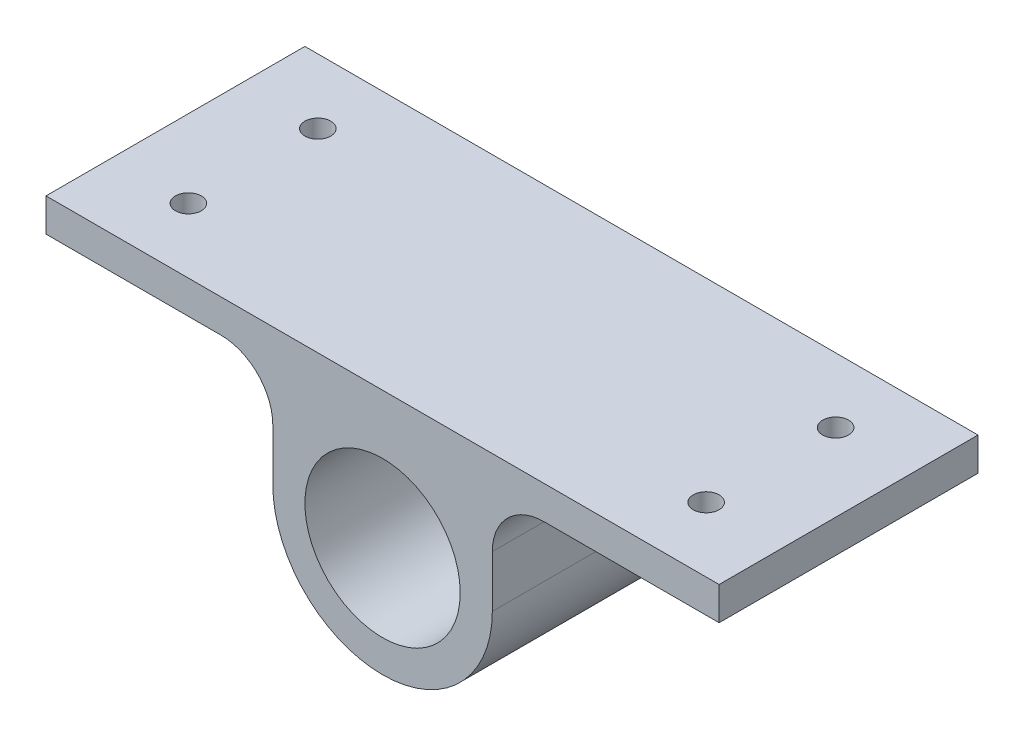
ISO-10303-21;
HEADER;
FILE_DESCRIPTION(('STEP AP214'),'2;1');
FILE_NAME('part.step','',(''),(''),'','','');
FILE_SCHEMA(('AUTOMOTIVE_DESIGN { 1 0 10303 214 1 1 1 1 }'));
ENDSEC;
DATA;
#1=APPLICATION_CONTEXT('core data for automotive mechanical design processes');
#2=APPLICATION_PROTOCOL_DEFINITION('international standard','automotive_design',2000,#1);
#3=PRODUCT_CONTEXT('',#1,'mechanical');
#4=PRODUCT('Part','Part','',(#3));
#5=PRODUCT_RELATED_PRODUCT_CATEGORY('part','',(#4));
#6=PRODUCT_DEFINITION_FORMATION('','',#4);
#7=PRODUCT_DEFINITION_CONTEXT('part definition',#1,'design');
#8=PRODUCT_DEFINITION('design','',#6,#7);
#9=PRODUCT_DEFINITION_SHAPE('','',#8);
#10=(LENGTH_UNIT() NAMED_UNIT(*) SI_UNIT(.MILLI.,.METRE.));
#11=(NAMED_UNIT(*) PLANE_ANGLE_UNIT() SI_UNIT($,.RADIAN.));
#12=(NAMED_UNIT(*) SI_UNIT($,.STERADIAN.) SOLID_ANGLE_UNIT());
#13=UNCERTAINTY_MEASURE_WITH_UNIT(LENGTH_MEASURE(1.E-05),#10,'distance_accuracy_value','');
#14=(GEOMETRIC_REPRESENTATION_CONTEXT(3) GLOBAL_UNCERTAINTY_ASSIGNED_CONTEXT((#13)) GLOBAL_UNIT_ASSIGNED_CONTEXT((#10,
#11,#12)) REPRESENTATION_CONTEXT('',''));
#15=CARTESIAN_POINT('',(0.,0.,0.));
#16=DIRECTION('',(0.,0.,1.));
#17=DIRECTION('',(1.,0.,0.));
#18=AXIS2_PLACEMENT_3D('',#15,#16,#17);
#19=CARTESIAN_POINT('',(0.,0.,250.));
#20=DIRECTION('',(0.,0.,1.));
#21=DIRECTION('',(1.,0.,0.));
#22=AXIS2_PLACEMENT_3D('',#19,#20,#21);
#23=PLANE('',#22);
#24=CARTESIAN_POINT('',(0.,0.,250.));
#25=DIRECTION('',(0.,0.,1.));
#26=DIRECTION('',(1.,0.,0.));
#27=AXIS2_PLACEMENT_3D('',#24,#25,#26);
#28=CIRCLE('',#27,106.);
#29=CARTESIAN_POINT('',(-106.,0.,250.));
#30=VERTEX_POINT('',#29);
#31=CARTESIAN_POINT('',(106.,0.,250.));
#32=VERTEX_POINT('',#31);
#33=EDGE_CURVE('E167',#30,#32,#28,.T.);
#34=ORIENTED_EDGE('',*,*,#33,.T.);
#35=DIRECTION('',(0.,1.,0.));
#36=VECTOR('',#35,1.);
#37=CARTESIAN_POINT('',(106.,50.,250.));
#38=LINE('',#37,#36);
#39=CARTESIAN_POINT('',(106.,50.,250.));
#40=VERTEX_POINT('',#39);
#41=EDGE_CURVE('E105',#32,#40,#38,.T.);
#42=ORIENTED_EDGE('',*,*,#41,.T.);
#43=CARTESIAN_POINT('',(156.,50.,250.));
#44=DIRECTION('',(0.,0.,-1.));
#45=DIRECTION('',(1.,0.,0.));
#46=AXIS2_PLACEMENT_3D('',#43,#44,#45);
#47=CIRCLE('',#46,50.);
#48=CARTESIAN_POINT('',(156.,100.,250.));
#49=VERTEX_POINT('',#48);
#50=EDGE_CURVE('E215',#40,#49,#47,.T.);
#51=ORIENTED_EDGE('',*,*,#50,.T.);
#52=DIRECTION('',(1.,0.,0.));
#53=VECTOR('',#52,1.);
#54=CARTESIAN_POINT('',(325.,100.,250.));
#55=LINE('',#54,#53);
#56=CARTESIAN_POINT('',(325.,100.,250.));
#57=VERTEX_POINT('',#56);
#58=EDGE_CURVE('E217',#49,#57,#55,.T.);
#59=ORIENTED_EDGE('',*,*,#58,.T.);
#60=DIRECTION('',(0.,1.,0.));
#61=VECTOR('',#60,1.);
#62=CARTESIAN_POINT('',(325.,132.,250.));
#63=LINE('',#62,#61);
#64=CARTESIAN_POINT('',(325.,132.,250.));
#65=VERTEX_POINT('',#64);
#66=EDGE_CURVE('E219',#57,#65,#63,.T.);
#67=ORIENTED_EDGE('',*,*,#66,.T.);
#68=DIRECTION('',(-1.,0.,0.));
#69=VECTOR('',#68,1.);
#70=CARTESIAN_POINT('',(-325.,132.,250.));
#71=LINE('',#70,#69);
#72=CARTESIAN_POINT('',(-325.,132.,250.));
#73=VERTEX_POINT('',#72);
#74=EDGE_CURVE('E221',#65,#73,#71,.T.);
#75=ORIENTED_EDGE('',*,*,#74,.T.);
#76=DIRECTION('',(0.,-1.,0.));
#77=VECTOR('',#76,1.);
#78=CARTESIAN_POINT('',(-325.,100.,250.));
#79=LINE('',#78,#77);
#80=CARTESIAN_POINT('',(-325.,100.,250.));
#81=VERTEX_POINT('',#80);
#82=EDGE_CURVE('E130',#73,#81,#79,.T.);
#83=ORIENTED_EDGE('',*,*,#82,.T.);
#84=DIRECTION('',(1.,0.,0.));
#85=VECTOR('',#84,1.);
#86=CARTESIAN_POINT('',(-156.,100.,250.));
#87=LINE('',#86,#85);
#88=CARTESIAN_POINT('',(-156.,100.,250.));
#89=VERTEX_POINT('',#88);
#90=EDGE_CURVE('E124',#81,#89,#87,.T.);
#91=ORIENTED_EDGE('',*,*,#90,.T.);
#92=CARTESIAN_POINT('',(-156.,50.,250.));
#93=DIRECTION('',(0.,0.,-1.));
#94=DIRECTION('',(1.,0.,0.));
#95=AXIS2_PLACEMENT_3D('',#92,#93,#94);
#96=CIRCLE('',#95,50.);
#97=CARTESIAN_POINT('',(-106.,49.9999999999997,250.));
#98=VERTEX_POINT('',#97);
#99=EDGE_CURVE('E128',#89,#98,#96,.T.);
#100=ORIENTED_EDGE('',*,*,#99,.T.);
#101=DIRECTION('',(0.,-1.,0.));
#102=VECTOR('',#101,1.);
#103=CARTESIAN_POINT('',(-106.,0.,250.));
#104=LINE('',#103,#102);
#105=EDGE_CURVE('E56',#98,#30,#104,.T.);
#106=ORIENTED_EDGE('',*,*,#105,.T.);
#107=EDGE_LOOP('',(#34,#42,#51,#59,#67,#75,#83,#91,#100,#106));
#108=FACE_BOUND('',#107,.T.);
#109=CARTESIAN_POINT('',(0.,0.,250.));
#110=DIRECTION('',(0.,0.,1.));
#111=DIRECTION('',(1.,0.,0.));
#112=AXIS2_PLACEMENT_3D('',#109,#110,#111);
#113=CIRCLE('',#112,75.);
#114=CARTESIAN_POINT('',(75.,0.,250.));
#115=VERTEX_POINT('',#114);
#116=EDGE_CURVE('E152',#115,#115,#113,.T.);
#117=ORIENTED_EDGE('',*,*,#116,.F.);
#118=EDGE_LOOP('',(#117));
#119=FACE_BOUND('',#118,.T.);
#120=ADVANCED_FACE('F37',(#108,#119),#23,.T.);
#121=CARTESIAN_POINT('',(0.,0.,0.));
#122=DIRECTION('',(0.,0.,1.));
#123=DIRECTION('',(1.,0.,0.));
#124=AXIS2_PLACEMENT_3D('',#121,#122,#123);
#125=PLANE('',#124);
#126=CARTESIAN_POINT('',(0.,0.,0.));
#127=DIRECTION('',(0.,0.,1.));
#128=DIRECTION('',(1.,0.,0.));
#129=AXIS2_PLACEMENT_3D('',#126,#127,#128);
#130=CIRCLE('',#129,106.);
#131=CARTESIAN_POINT('',(-106.,0.,0.));
#132=VERTEX_POINT('',#131);
#133=CARTESIAN_POINT('',(106.,0.,0.));
#134=VERTEX_POINT('',#133);
#135=EDGE_CURVE('E148',#132,#134,#130,.T.);
#136=ORIENTED_EDGE('',*,*,#135,.F.);
#137=DIRECTION('',(0.,-1.,0.));
#138=VECTOR('',#137,1.);
#139=CARTESIAN_POINT('',(-106.,0.,0.));
#140=LINE('',#139,#138);
#141=CARTESIAN_POINT('',(-106.,49.9999999999997,0.));
#142=VERTEX_POINT('',#141);
#143=EDGE_CURVE('E97',#142,#132,#140,.T.);
#144=ORIENTED_EDGE('',*,*,#143,.F.);
#145=CARTESIAN_POINT('',(-156.,50.,0.));
#146=DIRECTION('',(0.,0.,-1.));
#147=DIRECTION('',(1.,0.,0.));
#148=AXIS2_PLACEMENT_3D('',#145,#146,#147);
#149=CIRCLE('',#148,50.);
#150=CARTESIAN_POINT('',(-156.,100.,0.));
#151=VERTEX_POINT('',#150);
#152=EDGE_CURVE('E91',#151,#142,#149,.T.);
#153=ORIENTED_EDGE('',*,*,#152,.F.);
#154=DIRECTION('',(1.,0.,0.));
#155=VECTOR('',#154,1.);
#156=CARTESIAN_POINT('',(-156.,100.,0.));
#157=LINE('',#156,#155);
#158=CARTESIAN_POINT('',(-325.,100.,0.));
#159=VERTEX_POINT('',#158);
#160=EDGE_CURVE('E138',#159,#151,#157,.T.);
#161=ORIENTED_EDGE('',*,*,#160,.F.);
#162=DIRECTION('',(0.,-1.,0.));
#163=VECTOR('',#162,1.);
#164=CARTESIAN_POINT('',(-325.,100.,0.));
#165=LINE('',#164,#163);
#166=CARTESIAN_POINT('',(-325.,132.,0.));
#167=VERTEX_POINT('',#166);
#168=EDGE_CURVE('E162',#167,#159,#165,.T.);
#169=ORIENTED_EDGE('',*,*,#168,.F.);
#170=DIRECTION('',(-1.,0.,0.));
#171=VECTOR('',#170,1.);
#172=CARTESIAN_POINT('',(-325.,132.,0.));
#173=LINE('',#172,#171);
#174=CARTESIAN_POINT('',(325.,132.,0.));
#175=VERTEX_POINT('',#174);
#176=EDGE_CURVE('E160',#175,#167,#173,.T.);
#177=ORIENTED_EDGE('',*,*,#176,.F.);
#178=DIRECTION('',(0.,1.,0.));
#179=VECTOR('',#178,1.);
#180=CARTESIAN_POINT('',(325.,132.,0.));
#181=LINE('',#180,#179);
#182=CARTESIAN_POINT('',(325.,100.,0.));
#183=VERTEX_POINT('',#182);
#184=EDGE_CURVE('E158',#183,#175,#181,.T.);
#185=ORIENTED_EDGE('',*,*,#184,.F.);
#186=DIRECTION('',(1.,0.,0.));
#187=VECTOR('',#186,1.);
#188=CARTESIAN_POINT('',(325.,100.,0.));
#189=LINE('',#188,#187);
#190=CARTESIAN_POINT('',(156.,100.,0.));
#191=VERTEX_POINT('',#190);
#192=EDGE_CURVE('E156',#191,#183,#189,.T.);
#193=ORIENTED_EDGE('',*,*,#192,.F.);
#194=CARTESIAN_POINT('',(156.,50.,0.));
#195=DIRECTION('',(0.,0.,-1.));
#196=DIRECTION('',(1.,0.,0.));
#197=AXIS2_PLACEMENT_3D('',#194,#195,#196);
#198=CIRCLE('',#197,50.);
#199=CARTESIAN_POINT('',(106.,50.,0.));
#200=VERTEX_POINT('',#199);
#201=EDGE_CURVE('E154',#200,#191,#198,.T.);
#202=ORIENTED_EDGE('',*,*,#201,.F.);
#203=DIRECTION('',(0.,1.,0.));
#204=VECTOR('',#203,1.);
#205=CARTESIAN_POINT('',(106.,50.,0.));
#206=LINE('',#205,#204);
#207=EDGE_CURVE('E151',#134,#200,#206,.T.);
#208=ORIENTED_EDGE('',*,*,#207,.F.);
#209=EDGE_LOOP('',(#136,#144,#153,#161,#169,#177,#185,#193,#202,#208));
#210=FACE_BOUND('',#209,.T.);
#211=CARTESIAN_POINT('',(0.,0.,0.));
#212=DIRECTION('',(0.,0.,1.));
#213=DIRECTION('',(1.,0.,0.));
#214=AXIS2_PLACEMENT_3D('',#211,#212,#213);
#215=CIRCLE('',#214,75.);
#216=CARTESIAN_POINT('',(75.,0.,0.));
#217=VERTEX_POINT('',#216);
#218=EDGE_CURVE('E208',#217,#217,#215,.T.);
#219=ORIENTED_EDGE('',*,*,#218,.T.);
#220=EDGE_LOOP('',(#219));
#221=FACE_BOUND('',#220,.T.);
#222=ADVANCED_FACE('F234',(#210,#221),#125,.F.);
#223=CARTESIAN_POINT('',(0.,0.,250.));
#224=DIRECTION('',(0.,0.,-1.));
#225=DIRECTION('',(-1.,0.,0.));
#226=AXIS2_PLACEMENT_3D('',#223,#224,#225);
#227=CYLINDRICAL_SURFACE('',#226,106.);
#228=ORIENTED_EDGE('',*,*,#135,.T.);
#229=DIRECTION('',(0.,0.,-1.));
#230=VECTOR('',#229,1.);
#231=CARTESIAN_POINT('',(106.,0.,250.));
#232=LINE('',#231,#230);
#233=EDGE_CURVE('E11',#32,#134,#232,.T.);
#234=ORIENTED_EDGE('',*,*,#233,.F.);
#235=ORIENTED_EDGE('',*,*,#33,.F.);
#236=DIRECTION('',(0.,0.,-1.));
#237=VECTOR('',#236,1.);
#238=CARTESIAN_POINT('',(-106.,0.,250.));
#239=LINE('',#238,#237);
#240=EDGE_CURVE('E144',#30,#132,#239,.T.);
#241=ORIENTED_EDGE('',*,*,#240,.T.);
#242=EDGE_LOOP('',(#228,#234,#235,#241));
#243=FACE_BOUND('',#242,.T.);
#244=ADVANCED_FACE('F39',(#243),#227,.T.);
#245=CARTESIAN_POINT('',(106.,50.,250.));
#246=DIRECTION('',(-1.,0.,0.));
#247=DIRECTION('',(0.,0.,1.));
#248=AXIS2_PLACEMENT_3D('',#245,#246,#247);
#249=PLANE('',#248);
#250=ORIENTED_EDGE('',*,*,#207,.T.);
#251=DIRECTION('',(0.,0.,-1.));
#252=VECTOR('',#251,1.);
#253=CARTESIAN_POINT('',(106.,50.,250.));
#254=LINE('',#253,#252);
#255=EDGE_CURVE('E47',#40,#200,#254,.T.);
#256=ORIENTED_EDGE('',*,*,#255,.F.);
#257=ORIENTED_EDGE('',*,*,#41,.F.);
#258=ORIENTED_EDGE('',*,*,#233,.T.);
#259=EDGE_LOOP('',(#250,#256,#257,#258));
#260=FACE_BOUND('',#259,.T.);
#261=ADVANCED_FACE('F298',(#260),#249,.F.);
#262=CARTESIAN_POINT('',(156.,50.,250.));
#263=DIRECTION('',(0.,0.,-1.));
#264=DIRECTION('',(-1.,0.,0.));
#265=AXIS2_PLACEMENT_3D('',#262,#263,#264);
#266=CYLINDRICAL_SURFACE('',#265,50.);
#267=ORIENTED_EDGE('',*,*,#201,.T.);
#268=DIRECTION('',(0.,0.,-1.));
#269=VECTOR('',#268,1.);
#270=CARTESIAN_POINT('',(156.,100.,250.));
#271=LINE('',#270,#269);
#272=EDGE_CURVE('E180',#49,#191,#271,.T.);
#273=ORIENTED_EDGE('',*,*,#272,.F.);
#274=ORIENTED_EDGE('',*,*,#50,.F.);
#275=ORIENTED_EDGE('',*,*,#255,.T.);
#276=EDGE_LOOP('',(#267,#273,#274,#275));
#277=FACE_BOUND('',#276,.T.);
#278=ADVANCED_FACE('F295',(#277),#266,.F.);
#279=CARTESIAN_POINT('',(325.,100.,250.));
#280=DIRECTION('',(0.,1.,0.));
#281=DIRECTION('',(-1.,0.,0.));
#282=AXIS2_PLACEMENT_3D('',#279,#280,#281);
#283=PLANE('',#282);
#284=CARTESIAN_POINT('',(250.,100.,62.5));
#285=DIRECTION('',(0.,1.,0.));
#286=DIRECTION('',(-1.,0.,0.));
#287=AXIS2_PLACEMENT_3D('',#284,#285,#286);
#288=CIRCLE('',#287,12.5);
#289=CARTESIAN_POINT('',(237.5,100.,62.5));
#290=VERTEX_POINT('',#289);
#291=EDGE_CURVE('E205',#290,#290,#288,.T.);
#292=ORIENTED_EDGE('',*,*,#291,.T.);
#293=EDGE_LOOP('',(#292));
#294=FACE_BOUND('',#293,.T.);
#295=CARTESIAN_POINT('',(250.,100.,187.5));
#296=DIRECTION('',(0.,1.,0.));
#297=DIRECTION('',(-1.,0.,0.));
#298=AXIS2_PLACEMENT_3D('',#295,#296,#297);
#299=CIRCLE('',#298,12.5);
#300=CARTESIAN_POINT('',(237.5,100.,187.5));
#301=VERTEX_POINT('',#300);
#302=EDGE_CURVE('E190',#301,#301,#299,.T.);
#303=ORIENTED_EDGE('',*,*,#302,.T.);
#304=EDGE_LOOP('',(#303));
#305=FACE_BOUND('',#304,.T.);
#306=ORIENTED_EDGE('',*,*,#192,.T.);
#307=DIRECTION('',(0.,0.,-1.));
#308=VECTOR('',#307,1.);
#309=CARTESIAN_POINT('',(325.,100.,250.));
#310=LINE('',#309,#308);
#311=EDGE_CURVE('E177',#57,#183,#310,.T.);
#312=ORIENTED_EDGE('',*,*,#311,.F.);
#313=ORIENTED_EDGE('',*,*,#58,.F.);
#314=ORIENTED_EDGE('',*,*,#272,.T.);
#315=EDGE_LOOP('',(#306,#312,#313,#314));
#316=FACE_BOUND('',#315,.T.);
#317=ADVANCED_FACE('F291',(#294,#305,#316),#283,.F.);
#318=CARTESIAN_POINT('',(325.,132.,250.));
#319=DIRECTION('',(-1.,0.,0.));
#320=DIRECTION('',(0.,0.,1.));
#321=AXIS2_PLACEMENT_3D('',#318,#319,#320);
#322=PLANE('',#321);
#323=ORIENTED_EDGE('',*,*,#184,.T.);
#324=DIRECTION('',(0.,0.,-1.));
#325=VECTOR('',#324,1.);
#326=CARTESIAN_POINT('',(325.,132.,250.));
#327=LINE('',#326,#325);
#328=EDGE_CURVE('E174',#65,#175,#327,.T.);
#329=ORIENTED_EDGE('',*,*,#328,.F.);
#330=ORIENTED_EDGE('',*,*,#66,.F.);
#331=ORIENTED_EDGE('',*,*,#311,.T.);
#332=EDGE_LOOP('',(#323,#329,#330,#331));
#333=FACE_BOUND('',#332,.T.);
#334=ADVANCED_FACE('F287',(#333),#322,.F.);
#335=CARTESIAN_POINT('',(-325.,132.,250.));
#336=DIRECTION('',(0.,-1.,0.));
#337=DIRECTION('',(0.,0.,-1.));
#338=AXIS2_PLACEMENT_3D('',#335,#336,#337);
#339=PLANE('',#338);
#340=CARTESIAN_POINT('',(250.,132.,62.5));
#341=DIRECTION('',(0.,1.,0.));
#342=DIRECTION('',(0.,0.,1.));
#343=AXIS2_PLACEMENT_3D('',#340,#341,#342);
#344=CIRCLE('',#343,12.5);
#345=CARTESIAN_POINT('',(250.,132.,75.));
#346=VERTEX_POINT('',#345);
#347=EDGE_CURVE('E201',#346,#346,#344,.T.);
#348=ORIENTED_EDGE('',*,*,#347,.F.);
#349=EDGE_LOOP('',(#348));
#350=FACE_BOUND('',#349,.T.);
#351=CARTESIAN_POINT('',(250.,132.,187.5));
#352=DIRECTION('',(0.,1.,0.));
#353=DIRECTION('',(0.,0.,1.));
#354=AXIS2_PLACEMENT_3D('',#351,#352,#353);
#355=CIRCLE('',#354,12.5);
#356=CARTESIAN_POINT('',(250.,132.,200.));
#357=VERTEX_POINT('',#356);
#358=EDGE_CURVE('E197',#357,#357,#355,.T.);
#359=ORIENTED_EDGE('',*,*,#358,.F.);
#360=EDGE_LOOP('',(#359));
#361=FACE_BOUND('',#360,.T.);
#362=CARTESIAN_POINT('',(-250.,132.,187.5));
#363=DIRECTION('',(0.,1.,0.));
#364=DIRECTION('',(0.,0.,1.));
#365=AXIS2_PLACEMENT_3D('',#362,#363,#364);
#366=CIRCLE('',#365,12.5);
#367=CARTESIAN_POINT('',(-250.,132.,200.));
#368=VERTEX_POINT('',#367);
#369=EDGE_CURVE('E192',#368,#368,#366,.T.);
#370=ORIENTED_EDGE('',*,*,#369,.F.);
#371=EDGE_LOOP('',(#370));
#372=FACE_BOUND('',#371,.T.);
#373=CARTESIAN_POINT('',(-250.,132.,62.5));
#374=DIRECTION('',(0.,1.,0.));
#375=DIRECTION('',(0.,0.,1.));
#376=AXIS2_PLACEMENT_3D('',#373,#374,#375);
#377=CIRCLE('',#376,12.5);
#378=CARTESIAN_POINT('',(-250.,132.,75.));
#379=VERTEX_POINT('',#378);
#380=EDGE_CURVE('E186',#379,#379,#377,.T.);
#381=ORIENTED_EDGE('',*,*,#380,.F.);
#382=EDGE_LOOP('',(#381));
#383=FACE_BOUND('',#382,.T.);
#384=ORIENTED_EDGE('',*,*,#176,.T.);
#385=DIRECTION('',(0.,0.,-1.));
#386=VECTOR('',#385,1.);
#387=CARTESIAN_POINT('',(-325.,132.,250.));
#388=LINE('',#387,#386);
#389=EDGE_CURVE('E171',#73,#167,#388,.T.);
#390=ORIENTED_EDGE('',*,*,#389,.F.);
#391=ORIENTED_EDGE('',*,*,#74,.F.);
#392=ORIENTED_EDGE('',*,*,#328,.T.);
#393=EDGE_LOOP('',(#384,#390,#391,#392));
#394=FACE_BOUND('',#393,.T.);
#395=ADVANCED_FACE('F227',(#350,#361,#372,#383,#394),#339,.F.);
#396=CARTESIAN_POINT('',(-325.,100.,250.));
#397=DIRECTION('',(1.,0.,0.));
#398=DIRECTION('',(0.,0.,-1.));
#399=AXIS2_PLACEMENT_3D('',#396,#397,#398);
#400=PLANE('',#399);
#401=ORIENTED_EDGE('',*,*,#168,.T.);
#402=DIRECTION('',(0.,0.,-1.));
#403=VECTOR('',#402,1.);
#404=CARTESIAN_POINT('',(-325.,100.,250.));
#405=LINE('',#404,#403);
#406=EDGE_CURVE('E139',#81,#159,#405,.T.);
#407=ORIENTED_EDGE('',*,*,#406,.F.);
#408=ORIENTED_EDGE('',*,*,#82,.F.);
#409=ORIENTED_EDGE('',*,*,#389,.T.);
#410=EDGE_LOOP('',(#401,#407,#408,#409));
#411=FACE_BOUND('',#410,.T.);
#412=ADVANCED_FACE('F231',(#411),#400,.F.);
#413=CARTESIAN_POINT('',(-156.,100.,250.));
#414=DIRECTION('',(0.,1.,0.));
#415=DIRECTION('',(-1.,0.,0.));
#416=AXIS2_PLACEMENT_3D('',#413,#414,#415);
#417=PLANE('',#416);
#418=CARTESIAN_POINT('',(-250.,100.,187.5));
#419=DIRECTION('',(0.,1.,0.));
#420=DIRECTION('',(-1.,0.,0.));
#421=AXIS2_PLACEMENT_3D('',#418,#419,#420);
#422=CIRCLE('',#421,12.5);
#423=CARTESIAN_POINT('',(-262.5,100.,187.5));
#424=VERTEX_POINT('',#423);
#425=EDGE_CURVE('E41',#424,#424,#422,.T.);
#426=ORIENTED_EDGE('',*,*,#425,.T.);
#427=EDGE_LOOP('',(#426));
#428=FACE_BOUND('',#427,.T.);
#429=CARTESIAN_POINT('',(-250.,100.,62.5));
#430=DIRECTION('',(0.,1.,0.));
#431=DIRECTION('',(-1.,0.,0.));
#432=AXIS2_PLACEMENT_3D('',#429,#430,#431);
#433=CIRCLE('',#432,12.5);
#434=CARTESIAN_POINT('',(-262.5,100.,62.5));
#435=VERTEX_POINT('',#434);
#436=EDGE_CURVE('E184',#435,#435,#433,.T.);
#437=ORIENTED_EDGE('',*,*,#436,.T.);
#438=EDGE_LOOP('',(#437));
#439=FACE_BOUND('',#438,.T.);
#440=ORIENTED_EDGE('',*,*,#160,.T.);
#441=DIRECTION('',(0.,0.,-1.));
#442=VECTOR('',#441,1.);
#443=CARTESIAN_POINT('',(-156.,100.,250.));
#444=LINE('',#443,#442);
#445=EDGE_CURVE('E135',#89,#151,#444,.T.);
#446=ORIENTED_EDGE('',*,*,#445,.F.);
#447=ORIENTED_EDGE('',*,*,#90,.F.);
#448=ORIENTED_EDGE('',*,*,#406,.T.);
#449=EDGE_LOOP('',(#440,#446,#447,#448));
#450=FACE_BOUND('',#449,.T.);
#451=ADVANCED_FACE('F136',(#428,#439,#450),#417,.F.);
#452=CARTESIAN_POINT('',(-156.,50.,250.));
#453=DIRECTION('',(0.,0.,-1.));
#454=DIRECTION('',(-1.,0.,0.));
#455=AXIS2_PLACEMENT_3D('',#452,#453,#454);
#456=CYLINDRICAL_SURFACE('',#455,50.);
#457=ORIENTED_EDGE('',*,*,#152,.T.);
#458=DIRECTION('',(0.,0.,-1.));
#459=VECTOR('',#458,1.);
#460=CARTESIAN_POINT('',(-106.,49.9999999999997,250.));
#461=LINE('',#460,#459);
#462=EDGE_CURVE('E140',#98,#142,#461,.T.);
#463=ORIENTED_EDGE('',*,*,#462,.F.);
#464=ORIENTED_EDGE('',*,*,#99,.F.);
#465=ORIENTED_EDGE('',*,*,#445,.T.);
#466=EDGE_LOOP('',(#457,#463,#464,#465));
#467=FACE_BOUND('',#466,.T.);
#468=ADVANCED_FACE('F142',(#467),#456,.F.);
#469=CARTESIAN_POINT('',(-106.,0.,250.));
#470=DIRECTION('',(1.,0.,0.));
#471=DIRECTION('',(0.,0.,-1.));
#472=AXIS2_PLACEMENT_3D('',#469,#470,#471);
#473=PLANE('',#472);
#474=ORIENTED_EDGE('',*,*,#143,.T.);
#475=ORIENTED_EDGE('',*,*,#240,.F.);
#476=ORIENTED_EDGE('',*,*,#105,.F.);
#477=ORIENTED_EDGE('',*,*,#462,.T.);
#478=EDGE_LOOP('',(#474,#475,#476,#477));
#479=FACE_BOUND('',#478,.T.);
#480=ADVANCED_FACE('F240',(#479),#473,.F.);
#481=CARTESIAN_POINT('',(0.,0.,250.));
#482=DIRECTION('',(0.,0.,-1.));
#483=DIRECTION('',(-1.,0.,0.));
#484=AXIS2_PLACEMENT_3D('',#481,#482,#483);
#485=CYLINDRICAL_SURFACE('',#484,75.);
#486=ORIENTED_EDGE('',*,*,#116,.T.);
#487=EDGE_LOOP('',(#486));
#488=FACE_BOUND('',#487,.T.);
#489=ORIENTED_EDGE('',*,*,#218,.F.);
#490=EDGE_LOOP('',(#489));
#491=FACE_BOUND('',#490,.T.);
#492=ADVANCED_FACE('F242',(#488,#491),#485,.F.);
#493=CARTESIAN_POINT('',(-250.,-118.,62.5));
#494=DIRECTION('',(0.,1.,0.));
#495=DIRECTION('',(0.,0.,1.));
#496=AXIS2_PLACEMENT_3D('',#493,#494,#495);
#497=CYLINDRICAL_SURFACE('',#496,12.5);
#498=ORIENTED_EDGE('',*,*,#380,.T.);
#499=EDGE_LOOP('',(#498));
#500=FACE_BOUND('',#499,.T.);
#501=ORIENTED_EDGE('',*,*,#436,.F.);
#502=EDGE_LOOP('',(#501));
#503=FACE_BOUND('',#502,.T.);
#504=ADVANCED_FACE('F248',(#500,#503),#497,.F.);
#505=CARTESIAN_POINT('',(-250.,-118.,187.5));
#506=DIRECTION('',(0.,1.,0.));
#507=DIRECTION('',(0.,0.,1.));
#508=AXIS2_PLACEMENT_3D('',#505,#506,#507);
#509=CYLINDRICAL_SURFACE('',#508,12.5);
#510=ORIENTED_EDGE('',*,*,#369,.T.);
#511=EDGE_LOOP('',(#510));
#512=FACE_BOUND('',#511,.T.);
#513=ORIENTED_EDGE('',*,*,#425,.F.);
#514=EDGE_LOOP('',(#513));
#515=FACE_BOUND('',#514,.T.);
#516=ADVANCED_FACE('F261',(#512,#515),#509,.F.);
#517=CARTESIAN_POINT('',(250.,-118.,187.5));
#518=DIRECTION('',(0.,1.,0.));
#519=DIRECTION('',(0.,0.,1.));
#520=AXIS2_PLACEMENT_3D('',#517,#518,#519);
#521=CYLINDRICAL_SURFACE('',#520,12.5);
#522=ORIENTED_EDGE('',*,*,#358,.T.);
#523=EDGE_LOOP('',(#522));
#524=FACE_BOUND('',#523,.T.);
#525=ORIENTED_EDGE('',*,*,#302,.F.);
#526=EDGE_LOOP('',(#525));
#527=FACE_BOUND('',#526,.T.);
#528=ADVANCED_FACE('F265',(#524,#527),#521,.F.);
#529=CARTESIAN_POINT('',(250.,-118.,62.5));
#530=DIRECTION('',(0.,1.,0.));
#531=DIRECTION('',(0.,0.,1.));
#532=AXIS2_PLACEMENT_3D('',#529,#530,#531);
#533=CYLINDRICAL_SURFACE('',#532,12.5);
#534=ORIENTED_EDGE('',*,*,#347,.T.);
#535=EDGE_LOOP('',(#534));
#536=FACE_BOUND('',#535,.T.);
#537=ORIENTED_EDGE('',*,*,#291,.F.);
#538=EDGE_LOOP('',(#537));
#539=FACE_BOUND('',#538,.T.);
#540=ADVANCED_FACE('F262',(#536,#539),#533,.F.);
#541=CLOSED_SHELL('',(#120,#222,#244,#261,#278,#317,#334,#395,#412,#451,#468,#480,#492,#504,
#516,#528,#540));
#542=MANIFOLD_SOLID_BREP('B2',#541);
#543=ADVANCED_BREP_SHAPE_REPRESENTATION('',(#18,#542),#14);
#544=SHAPE_DEFINITION_REPRESENTATION(#9,#543);
ENDSEC;
END-ISO-10303-21;
